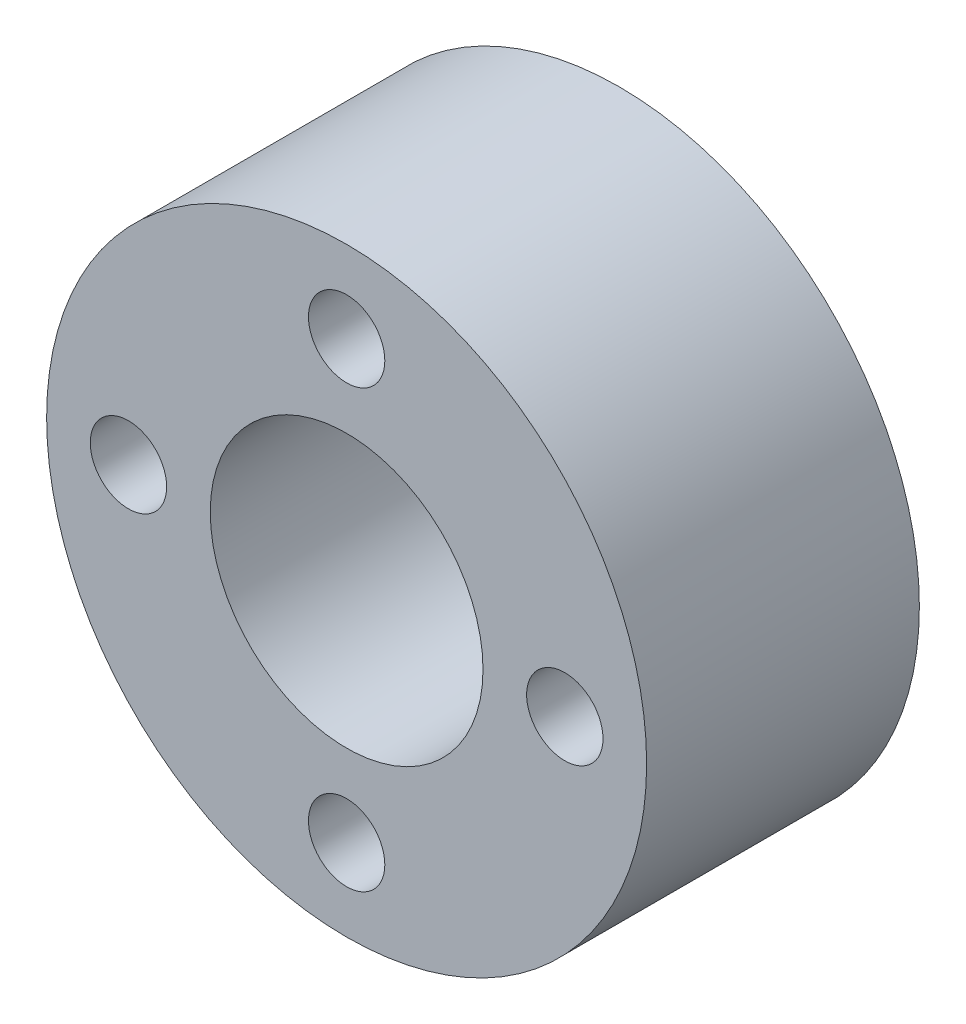
ISO-10303-21;
HEADER;
FILE_DESCRIPTION(('STEP AP214'),'2;1');
FILE_NAME('part.step','',(''),(''),'','','');
FILE_SCHEMA(('AUTOMOTIVE_DESIGN { 1 0 10303 214 1 1 1 1 }'));
ENDSEC;
DATA;
#1=APPLICATION_CONTEXT('core data for automotive mechanical design processes');
#2=APPLICATION_PROTOCOL_DEFINITION('international standard','automotive_design',2000,#1);
#3=PRODUCT_CONTEXT('',#1,'mechanical');
#4=PRODUCT('Part','Part','',(#3));
#5=PRODUCT_RELATED_PRODUCT_CATEGORY('part','',(#4));
#6=PRODUCT_DEFINITION_FORMATION('','',#4);
#7=PRODUCT_DEFINITION_CONTEXT('part definition',#1,'design');
#8=PRODUCT_DEFINITION('design','',#6,#7);
#9=PRODUCT_DEFINITION_SHAPE('','',#8);
#10=(LENGTH_UNIT() NAMED_UNIT(*) SI_UNIT(.MILLI.,.METRE.));
#11=(NAMED_UNIT(*) PLANE_ANGLE_UNIT() SI_UNIT($,.RADIAN.));
#12=(NAMED_UNIT(*) SI_UNIT($,.STERADIAN.) SOLID_ANGLE_UNIT());
#13=UNCERTAINTY_MEASURE_WITH_UNIT(LENGTH_MEASURE(1.E-05),#10,'distance_accuracy_value','');
#14=(GEOMETRIC_REPRESENTATION_CONTEXT(3) GLOBAL_UNCERTAINTY_ASSIGNED_CONTEXT((#13)) GLOBAL_UNIT_ASSIGNED_CONTEXT((#10,
#11,#12)) REPRESENTATION_CONTEXT('',''));
#15=CARTESIAN_POINT('',(0.,0.,0.));
#16=DIRECTION('',(0.,0.,1.));
#17=DIRECTION('',(1.,0.,0.));
#18=AXIS2_PLACEMENT_3D('',#15,#16,#17);
#19=CARTESIAN_POINT('',(0.,0.,-25.));
#20=DIRECTION('',(0.,0.,1.));
#21=DIRECTION('',(1.,0.,0.));
#22=AXIS2_PLACEMENT_3D('',#19,#20,#21);
#23=CYLINDRICAL_SURFACE('',#22,27.5);
#24=CARTESIAN_POINT('',(0.,0.,-25.));
#25=DIRECTION('',(0.,0.,1.));
#26=DIRECTION('',(1.,0.,0.));
#27=AXIS2_PLACEMENT_3D('',#24,#25,#26);
#28=CIRCLE('',#27,27.5);
#29=CARTESIAN_POINT('',(27.5,0.,-25.));
#30=VERTEX_POINT('',#29);
#31=EDGE_CURVE('E10',#30,#30,#28,.T.);
#32=ORIENTED_EDGE('',*,*,#31,.T.);
#33=EDGE_LOOP('',(#32));
#34=FACE_BOUND('',#33,.T.);
#35=CARTESIAN_POINT('',(0.,0.,0.));
#36=DIRECTION('',(0.,0.,1.));
#37=DIRECTION('',(1.,0.,0.));
#38=AXIS2_PLACEMENT_3D('',#35,#36,#37);
#39=CIRCLE('',#38,27.5);
#40=CARTESIAN_POINT('',(27.5,0.,0.));
#41=VERTEX_POINT('',#40);
#42=EDGE_CURVE('E37',#41,#41,#39,.T.);
#43=ORIENTED_EDGE('',*,*,#42,.F.);
#44=EDGE_LOOP('',(#43));
#45=FACE_BOUND('',#44,.T.);
#46=ADVANCED_FACE('F40',(#34,#45),#23,.T.);
#47=CARTESIAN_POINT('',(0.,0.,-25.));
#48=DIRECTION('',(0.,0.,1.));
#49=DIRECTION('',(1.,0.,0.));
#50=AXIS2_PLACEMENT_3D('',#47,#48,#49);
#51=PLANE('',#50);
#52=CARTESIAN_POINT('',(20.,0.,-25.));
#53=DIRECTION('',(0.,0.,1.));
#54=DIRECTION('',(1.,0.,0.));
#55=AXIS2_PLACEMENT_3D('',#52,#53,#54);
#56=CIRCLE('',#55,3.5);
#57=CARTESIAN_POINT('',(23.5,0.,-25.));
#58=VERTEX_POINT('',#57);
#59=EDGE_CURVE('E64',#58,#58,#56,.T.);
#60=ORIENTED_EDGE('',*,*,#59,.T.);
#61=EDGE_LOOP('',(#60));
#62=FACE_BOUND('',#61,.T.);
#63=CARTESIAN_POINT('',(0.,20.,-25.));
#64=DIRECTION('',(0.,0.,1.));
#65=DIRECTION('',(1.,0.,0.));
#66=AXIS2_PLACEMENT_3D('',#63,#64,#65);
#67=CIRCLE('',#66,3.5);
#68=CARTESIAN_POINT('',(3.5,20.,-25.));
#69=VERTEX_POINT('',#68);
#70=EDGE_CURVE('E54',#69,#69,#67,.T.);
#71=ORIENTED_EDGE('',*,*,#70,.T.);
#72=EDGE_LOOP('',(#71));
#73=FACE_BOUND('',#72,.T.);
#74=CARTESIAN_POINT('',(-20.,0.,-25.));
#75=DIRECTION('',(0.,0.,1.));
#76=DIRECTION('',(1.,0.,0.));
#77=AXIS2_PLACEMENT_3D('',#74,#75,#76);
#78=CIRCLE('',#77,3.5);
#79=CARTESIAN_POINT('',(-16.5,0.,-25.));
#80=VERTEX_POINT('',#79);
#81=EDGE_CURVE('E71',#80,#80,#78,.T.);
#82=ORIENTED_EDGE('',*,*,#81,.T.);
#83=EDGE_LOOP('',(#82));
#84=FACE_BOUND('',#83,.T.);
#85=CARTESIAN_POINT('',(0.,-20.,-25.));
#86=DIRECTION('',(0.,0.,1.));
#87=DIRECTION('',(1.,0.,0.));
#88=AXIS2_PLACEMENT_3D('',#85,#86,#87);
#89=CIRCLE('',#88,3.5);
#90=CARTESIAN_POINT('',(3.5,-20.,-25.));
#91=VERTEX_POINT('',#90);
#92=EDGE_CURVE('E70',#91,#91,#89,.T.);
#93=ORIENTED_EDGE('',*,*,#92,.T.);
#94=EDGE_LOOP('',(#93));
#95=FACE_BOUND('',#94,.T.);
#96=CARTESIAN_POINT('',(0.,0.,-25.));
#97=DIRECTION('',(0.,0.,1.));
#98=DIRECTION('',(1.,0.,0.));
#99=AXIS2_PLACEMENT_3D('',#96,#97,#98);
#100=CIRCLE('',#99,12.5);
#101=CARTESIAN_POINT('',(12.5,0.,-25.));
#102=VERTEX_POINT('',#101);
#103=EDGE_CURVE('E50',#102,#102,#100,.T.);
#104=ORIENTED_EDGE('',*,*,#103,.T.);
#105=EDGE_LOOP('',(#104));
#106=FACE_BOUND('',#105,.T.);
#107=ORIENTED_EDGE('',*,*,#31,.F.);
#108=EDGE_LOOP('',(#107));
#109=FACE_BOUND('',#108,.T.);
#110=ADVANCED_FACE('F83',(#62,#73,#84,#95,#106,#109),#51,.F.);
#111=CARTESIAN_POINT('',(0.,0.,0.));
#112=DIRECTION('',(0.,0.,1.));
#113=DIRECTION('',(1.,0.,0.));
#114=AXIS2_PLACEMENT_3D('',#111,#112,#113);
#115=PLANE('',#114);
#116=CARTESIAN_POINT('',(20.,0.,0.));
#117=DIRECTION('',(0.,0.,1.));
#118=DIRECTION('',(1.,0.,0.));
#119=AXIS2_PLACEMENT_3D('',#116,#117,#118);
#120=CIRCLE('',#119,3.5);
#121=CARTESIAN_POINT('',(23.5,0.,0.));
#122=VERTEX_POINT('',#121);
#123=EDGE_CURVE('E55',#122,#122,#120,.T.);
#124=ORIENTED_EDGE('',*,*,#123,.F.);
#125=EDGE_LOOP('',(#124));
#126=FACE_BOUND('',#125,.T.);
#127=CARTESIAN_POINT('',(0.,20.,0.));
#128=DIRECTION('',(0.,0.,1.));
#129=DIRECTION('',(1.,0.,0.));
#130=AXIS2_PLACEMENT_3D('',#127,#128,#129);
#131=CIRCLE('',#130,3.5);
#132=CARTESIAN_POINT('',(3.5,20.,0.));
#133=VERTEX_POINT('',#132);
#134=EDGE_CURVE('E59',#133,#133,#131,.T.);
#135=ORIENTED_EDGE('',*,*,#134,.F.);
#136=EDGE_LOOP('',(#135));
#137=FACE_BOUND('',#136,.T.);
#138=CARTESIAN_POINT('',(-20.,0.,0.));
#139=DIRECTION('',(0.,0.,1.));
#140=DIRECTION('',(1.,0.,0.));
#141=AXIS2_PLACEMENT_3D('',#138,#139,#140);
#142=CIRCLE('',#141,3.5);
#143=CARTESIAN_POINT('',(-16.5,0.,0.));
#144=VERTEX_POINT('',#143);
#145=EDGE_CURVE('E56',#144,#144,#142,.T.);
#146=ORIENTED_EDGE('',*,*,#145,.F.);
#147=EDGE_LOOP('',(#146));
#148=FACE_BOUND('',#147,.T.);
#149=CARTESIAN_POINT('',(0.,-20.,0.));
#150=DIRECTION('',(0.,0.,1.));
#151=DIRECTION('',(1.,0.,0.));
#152=AXIS2_PLACEMENT_3D('',#149,#150,#151);
#153=CIRCLE('',#152,3.5);
#154=CARTESIAN_POINT('',(3.5,-20.,0.));
#155=VERTEX_POINT('',#154);
#156=EDGE_CURVE('E68',#155,#155,#153,.T.);
#157=ORIENTED_EDGE('',*,*,#156,.F.);
#158=EDGE_LOOP('',(#157));
#159=FACE_BOUND('',#158,.T.);
#160=CARTESIAN_POINT('',(0.,0.,0.));
#161=DIRECTION('',(0.,0.,1.));
#162=DIRECTION('',(1.,0.,0.));
#163=AXIS2_PLACEMENT_3D('',#160,#161,#162);
#164=CIRCLE('',#163,12.5);
#165=CARTESIAN_POINT('',(12.5,0.,0.));
#166=VERTEX_POINT('',#165);
#167=EDGE_CURVE('E47',#166,#166,#164,.T.);
#168=ORIENTED_EDGE('',*,*,#167,.F.);
#169=EDGE_LOOP('',(#168));
#170=FACE_BOUND('',#169,.T.);
#171=ORIENTED_EDGE('',*,*,#42,.T.);
#172=EDGE_LOOP('',(#171));
#173=FACE_BOUND('',#172,.T.);
#174=ADVANCED_FACE('F82',(#126,#137,#148,#159,#170,#173),#115,.T.);
#175=CARTESIAN_POINT('',(0.,0.,-25.));
#176=DIRECTION('',(0.,0.,1.));
#177=DIRECTION('',(1.,0.,0.));
#178=AXIS2_PLACEMENT_3D('',#175,#176,#177);
#179=CYLINDRICAL_SURFACE('',#178,12.5);
#180=ORIENTED_EDGE('',*,*,#103,.F.);
#181=EDGE_LOOP('',(#180));
#182=FACE_BOUND('',#181,.T.);
#183=ORIENTED_EDGE('',*,*,#167,.T.);
#184=EDGE_LOOP('',(#183));
#185=FACE_BOUND('',#184,.T.);
#186=ADVANCED_FACE('F81',(#182,#185),#179,.F.);
#187=CARTESIAN_POINT('',(0.,-20.,-25.));
#188=DIRECTION('',(0.,0.,1.));
#189=DIRECTION('',(1.,0.,0.));
#190=AXIS2_PLACEMENT_3D('',#187,#188,#189);
#191=CYLINDRICAL_SURFACE('',#190,3.5);
#192=ORIENTED_EDGE('',*,*,#92,.F.);
#193=EDGE_LOOP('',(#192));
#194=FACE_BOUND('',#193,.T.);
#195=ORIENTED_EDGE('',*,*,#156,.T.);
#196=EDGE_LOOP('',(#195));
#197=FACE_BOUND('',#196,.T.);
#198=ADVANCED_FACE('F104',(#194,#197),#191,.F.);
#199=CARTESIAN_POINT('',(-20.,0.,-25.));
#200=DIRECTION('',(0.,0.,1.));
#201=DIRECTION('',(1.,0.,0.));
#202=AXIS2_PLACEMENT_3D('',#199,#200,#201);
#203=CYLINDRICAL_SURFACE('',#202,3.5);
#204=ORIENTED_EDGE('',*,*,#81,.F.);
#205=EDGE_LOOP('',(#204));
#206=FACE_BOUND('',#205,.T.);
#207=ORIENTED_EDGE('',*,*,#145,.T.);
#208=EDGE_LOOP('',(#207));
#209=FACE_BOUND('',#208,.T.);
#210=ADVANCED_FACE('F80',(#206,#209),#203,.F.);
#211=CARTESIAN_POINT('',(0.,20.,-25.));
#212=DIRECTION('',(0.,0.,1.));
#213=DIRECTION('',(1.,0.,0.));
#214=AXIS2_PLACEMENT_3D('',#211,#212,#213);
#215=CYLINDRICAL_SURFACE('',#214,3.5);
#216=ORIENTED_EDGE('',*,*,#70,.F.);
#217=EDGE_LOOP('',(#216));
#218=FACE_BOUND('',#217,.T.);
#219=ORIENTED_EDGE('',*,*,#134,.T.);
#220=EDGE_LOOP('',(#219));
#221=FACE_BOUND('',#220,.T.);
#222=ADVANCED_FACE('F110',(#218,#221),#215,.F.);
#223=CARTESIAN_POINT('',(20.,0.,-25.));
#224=DIRECTION('',(0.,0.,1.));
#225=DIRECTION('',(1.,0.,0.));
#226=AXIS2_PLACEMENT_3D('',#223,#224,#225);
#227=CYLINDRICAL_SURFACE('',#226,3.5);
#228=ORIENTED_EDGE('',*,*,#59,.F.);
#229=EDGE_LOOP('',(#228));
#230=FACE_BOUND('',#229,.T.);
#231=ORIENTED_EDGE('',*,*,#123,.T.);
#232=EDGE_LOOP('',(#231));
#233=FACE_BOUND('',#232,.T.);
#234=ADVANCED_FACE('F109',(#230,#233),#227,.F.);
#235=CLOSED_SHELL('',(#46,#110,#174,#186,#198,#210,#222,#234));
#236=MANIFOLD_SOLID_BREP('B2',#235);
#237=ADVANCED_BREP_SHAPE_REPRESENTATION('',(#18,#236),#14);
#238=SHAPE_DEFINITION_REPRESENTATION(#9,#237);
ENDSEC;
END-ISO-10303-21;
